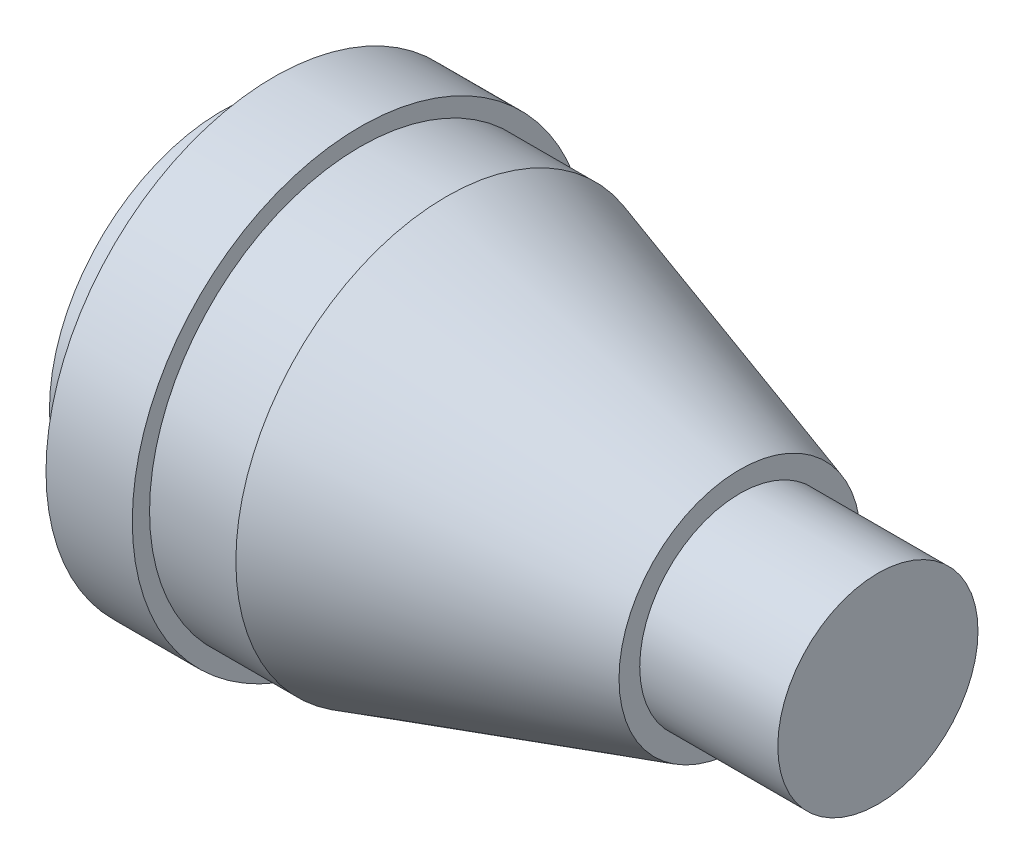
ISO-10303-21;
HEADER;
FILE_DESCRIPTION(('STEP AP214'),'2;1');
FILE_NAME('part.step','',(''),(''),'','','');
FILE_SCHEMA(('AUTOMOTIVE_DESIGN { 1 0 10303 214 1 1 1 1 }'));
ENDSEC;
DATA;
#1=APPLICATION_CONTEXT('core data for automotive mechanical design processes');
#2=APPLICATION_PROTOCOL_DEFINITION('international standard','automotive_design',2000,#1);
#3=PRODUCT_CONTEXT('',#1,'mechanical');
#4=PRODUCT('Part','Part','',(#3));
#5=PRODUCT_RELATED_PRODUCT_CATEGORY('part','',(#4));
#6=PRODUCT_DEFINITION_FORMATION('','',#4);
#7=PRODUCT_DEFINITION_CONTEXT('part definition',#1,'design');
#8=PRODUCT_DEFINITION('design','',#6,#7);
#9=PRODUCT_DEFINITION_SHAPE('','',#8);
#10=(LENGTH_UNIT() NAMED_UNIT(*) SI_UNIT(.MILLI.,.METRE.));
#11=(NAMED_UNIT(*) PLANE_ANGLE_UNIT() SI_UNIT($,.RADIAN.));
#12=(NAMED_UNIT(*) SI_UNIT($,.STERADIAN.) SOLID_ANGLE_UNIT());
#13=UNCERTAINTY_MEASURE_WITH_UNIT(LENGTH_MEASURE(1.E-05),#10,'distance_accuracy_value','');
#14=(GEOMETRIC_REPRESENTATION_CONTEXT(3) GLOBAL_UNCERTAINTY_ASSIGNED_CONTEXT((#13)) GLOBAL_UNIT_ASSIGNED_CONTEXT((#10,
#11,#12)) REPRESENTATION_CONTEXT('',''));
#15=CARTESIAN_POINT('',(0.,0.,0.));
#16=DIRECTION('',(0.,0.,1.));
#17=DIRECTION('',(1.,0.,0.));
#18=AXIS2_PLACEMENT_3D('',#15,#16,#17);
#19=CARTESIAN_POINT('',(0.,0.,0.));
#20=DIRECTION('',(1.,0.,0.));
#21=DIRECTION('',(0.,0.,-1.));
#22=AXIS2_PLACEMENT_3D('',#19,#20,#21);
#23=PLANE('',#22);
#24=CARTESIAN_POINT('',(0.,0.,0.));
#25=DIRECTION('',(-1.,0.,0.));
#26=DIRECTION('',(0.,0.,1.));
#27=AXIS2_PLACEMENT_3D('',#24,#25,#26);
#28=CIRCLE('',#27,10.);
#29=CARTESIAN_POINT('',(0.,0.,10.));
#30=VERTEX_POINT('',#29);
#31=EDGE_CURVE('E10',#30,#30,#28,.T.);
#32=ORIENTED_EDGE('',*,*,#31,.T.);
#33=EDGE_LOOP('',(#32));
#34=FACE_BOUND('',#33,.T.);
#35=ADVANCED_FACE('F32',(#34),#23,.F.);
#36=CARTESIAN_POINT('',(0.,0.,0.));
#37=DIRECTION('',(-1.,0.,0.));
#38=DIRECTION('',(0.,0.,1.));
#39=AXIS2_PLACEMENT_3D('',#36,#37,#38);
#40=CYLINDRICAL_SURFACE('',#39,10.);
#41=ORIENTED_EDGE('',*,*,#31,.F.);
#42=EDGE_LOOP('',(#41));
#43=FACE_BOUND('',#42,.T.);
#44=CARTESIAN_POINT('',(3.,0.,0.));
#45=DIRECTION('',(-1.,0.,0.));
#46=DIRECTION('',(0.,0.,1.));
#47=AXIS2_PLACEMENT_3D('',#44,#45,#46);
#48=CIRCLE('',#47,10.);
#49=CARTESIAN_POINT('',(3.,0.,10.));
#50=VERTEX_POINT('',#49);
#51=EDGE_CURVE('E38',#50,#50,#48,.T.);
#52=ORIENTED_EDGE('',*,*,#51,.T.);
#53=EDGE_LOOP('',(#52));
#54=FACE_BOUND('',#53,.T.);
#55=ADVANCED_FACE('F79',(#43,#54),#40,.T.);
#56=CARTESIAN_POINT('',(3.,10.,0.));
#57=DIRECTION('',(1.,0.,0.));
#58=DIRECTION('',(0.,0.,-1.));
#59=AXIS2_PLACEMENT_3D('',#56,#57,#58);
#60=PLANE('',#59);
#61=ORIENTED_EDGE('',*,*,#51,.F.);
#62=EDGE_LOOP('',(#61));
#63=FACE_BOUND('',#62,.T.);
#64=CARTESIAN_POINT('',(3.,0.,0.));
#65=DIRECTION('',(-1.,0.,0.));
#66=DIRECTION('',(0.,0.,1.));
#67=AXIS2_PLACEMENT_3D('',#64,#65,#66);
#68=CIRCLE('',#67,13.2);
#69=CARTESIAN_POINT('',(3.,0.,13.2));
#70=VERTEX_POINT('',#69);
#71=EDGE_CURVE('E42',#70,#70,#68,.T.);
#72=ORIENTED_EDGE('',*,*,#71,.T.);
#73=EDGE_LOOP('',(#72));
#74=FACE_BOUND('',#73,.T.);
#75=ADVANCED_FACE('F83',(#63,#74),#60,.F.);
#76=CARTESIAN_POINT('',(0.,0.,0.));
#77=DIRECTION('',(-1.,0.,0.));
#78=DIRECTION('',(0.,0.,1.));
#79=AXIS2_PLACEMENT_3D('',#76,#77,#78);
#80=CYLINDRICAL_SURFACE('',#79,13.2);
#81=ORIENTED_EDGE('',*,*,#71,.F.);
#82=EDGE_LOOP('',(#81));
#83=FACE_BOUND('',#82,.T.);
#84=CARTESIAN_POINT('',(8.,0.,0.));
#85=DIRECTION('',(-1.,0.,0.));
#86=DIRECTION('',(0.,0.,1.));
#87=AXIS2_PLACEMENT_3D('',#84,#85,#86);
#88=CIRCLE('',#87,13.2);
#89=CARTESIAN_POINT('',(8.,0.,13.2));
#90=VERTEX_POINT('',#89);
#91=EDGE_CURVE('E46',#90,#90,#88,.T.);
#92=ORIENTED_EDGE('',*,*,#91,.T.);
#93=EDGE_LOOP('',(#92));
#94=FACE_BOUND('',#93,.T.);
#95=ADVANCED_FACE('F88',(#83,#94),#80,.T.);
#96=CARTESIAN_POINT('',(8.,13.2,0.));
#97=DIRECTION('',(-1.,0.,0.));
#98=DIRECTION('',(0.,0.,1.));
#99=AXIS2_PLACEMENT_3D('',#96,#97,#98);
#100=PLANE('',#99);
#101=ORIENTED_EDGE('',*,*,#91,.F.);
#102=EDGE_LOOP('',(#101));
#103=FACE_BOUND('',#102,.T.);
#104=CARTESIAN_POINT('',(8.,0.,0.));
#105=DIRECTION('',(-1.,0.,0.));
#106=DIRECTION('',(0.,0.,1.));
#107=AXIS2_PLACEMENT_3D('',#104,#105,#106);
#108=CIRCLE('',#107,12.2);
#109=CARTESIAN_POINT('',(8.,0.,12.2));
#110=VERTEX_POINT('',#109);
#111=EDGE_CURVE('E51',#110,#110,#108,.T.);
#112=ORIENTED_EDGE('',*,*,#111,.T.);
#113=EDGE_LOOP('',(#112));
#114=FACE_BOUND('',#113,.T.);
#115=ADVANCED_FACE('F94',(#103,#114),#100,.F.);
#116=CARTESIAN_POINT('',(0.,0.,0.));
#117=DIRECTION('',(-1.,0.,0.));
#118=DIRECTION('',(0.,0.,1.));
#119=AXIS2_PLACEMENT_3D('',#116,#117,#118);
#120=CYLINDRICAL_SURFACE('',#119,12.2);
#121=ORIENTED_EDGE('',*,*,#111,.F.);
#122=EDGE_LOOP('',(#121));
#123=FACE_BOUND('',#122,.T.);
#124=CARTESIAN_POINT('',(13.,0.,0.));
#125=DIRECTION('',(-1.,0.,0.));
#126=DIRECTION('',(0.,0.,1.));
#127=AXIS2_PLACEMENT_3D('',#124,#125,#126);
#128=CIRCLE('',#127,12.2);
#129=CARTESIAN_POINT('',(13.,0.,12.2));
#130=VERTEX_POINT('',#129);
#131=EDGE_CURVE('E54',#130,#130,#128,.T.);
#132=ORIENTED_EDGE('',*,*,#131,.T.);
#133=EDGE_LOOP('',(#132));
#134=FACE_BOUND('',#133,.T.);
#135=ADVANCED_FACE('F98',(#123,#134),#120,.T.);
#136=CARTESIAN_POINT('',(30.,0.,0.));
#137=DIRECTION('',(-1.,0.,0.));
#138=DIRECTION('',(0.,0.,1.));
#139=AXIS2_PLACEMENT_3D('',#136,#137,#138);
#140=CONICAL_SURFACE('',#139,7.,0.296844673376403);
#141=ORIENTED_EDGE('',*,*,#131,.F.);
#142=EDGE_LOOP('',(#141));
#143=FACE_BOUND('',#142,.T.);
#144=CARTESIAN_POINT('',(30.,0.,0.));
#145=DIRECTION('',(-1.,0.,0.));
#146=DIRECTION('',(0.,0.,1.));
#147=AXIS2_PLACEMENT_3D('',#144,#145,#146);
#148=CIRCLE('',#147,7.);
#149=CARTESIAN_POINT('',(30.,0.,7.));
#150=VERTEX_POINT('',#149);
#151=EDGE_CURVE('E57',#150,#150,#148,.T.);
#152=ORIENTED_EDGE('',*,*,#151,.T.);
#153=EDGE_LOOP('',(#152));
#154=FACE_BOUND('',#153,.T.);
#155=ADVANCED_FACE('F102',(#143,#154),#140,.T.);
#156=CARTESIAN_POINT('',(30.,7.,0.));
#157=DIRECTION('',(-1.,0.,0.));
#158=DIRECTION('',(0.,0.,1.));
#159=AXIS2_PLACEMENT_3D('',#156,#157,#158);
#160=PLANE('',#159);
#161=ORIENTED_EDGE('',*,*,#151,.F.);
#162=EDGE_LOOP('',(#161));
#163=FACE_BOUND('',#162,.T.);
#164=CARTESIAN_POINT('',(30.,0.,0.));
#165=DIRECTION('',(-1.,0.,0.));
#166=DIRECTION('',(0.,0.,1.));
#167=AXIS2_PLACEMENT_3D('',#164,#165,#166);
#168=CIRCLE('',#167,5.8);
#169=CARTESIAN_POINT('',(30.,0.,5.8));
#170=VERTEX_POINT('',#169);
#171=EDGE_CURVE('E60',#170,#170,#168,.T.);
#172=ORIENTED_EDGE('',*,*,#171,.T.);
#173=EDGE_LOOP('',(#172));
#174=FACE_BOUND('',#173,.T.);
#175=ADVANCED_FACE('F75',(#163,#174),#160,.F.);
#176=CARTESIAN_POINT('',(0.,0.,0.));
#177=DIRECTION('',(-1.,0.,0.));
#178=DIRECTION('',(0.,0.,1.));
#179=AXIS2_PLACEMENT_3D('',#176,#177,#178);
#180=CYLINDRICAL_SURFACE('',#179,5.8);
#181=ORIENTED_EDGE('',*,*,#171,.F.);
#182=EDGE_LOOP('',(#181));
#183=FACE_BOUND('',#182,.T.);
#184=CARTESIAN_POINT('',(38.,0.,0.));
#185=DIRECTION('',(-1.,0.,0.));
#186=DIRECTION('',(0.,0.,1.));
#187=AXIS2_PLACEMENT_3D('',#184,#185,#186);
#188=CIRCLE('',#187,5.8);
#189=CARTESIAN_POINT('',(38.,0.,5.8));
#190=VERTEX_POINT('',#189);
#191=EDGE_CURVE('E63',#190,#190,#188,.T.);
#192=ORIENTED_EDGE('',*,*,#191,.T.);
#193=EDGE_LOOP('',(#192));
#194=FACE_BOUND('',#193,.T.);
#195=ADVANCED_FACE('F67',(#183,#194),#180,.T.);
#196=CARTESIAN_POINT('',(38.,5.8,0.));
#197=DIRECTION('',(-1.,0.,0.));
#198=DIRECTION('',(0.,0.,1.));
#199=AXIS2_PLACEMENT_3D('',#196,#197,#198);
#200=PLANE('',#199);
#201=ORIENTED_EDGE('',*,*,#191,.F.);
#202=EDGE_LOOP('',(#201));
#203=FACE_BOUND('',#202,.T.);
#204=ADVANCED_FACE('F69',(#203),#200,.F.);
#205=CLOSED_SHELL('',(#35,#55,#75,#95,#115,#135,#155,#175,#195,#204));
#206=MANIFOLD_SOLID_BREP('B2',#205);
#207=ADVANCED_BREP_SHAPE_REPRESENTATION('',(#18,#206),#14);
#208=SHAPE_DEFINITION_REPRESENTATION(#9,#207);
ENDSEC;
END-ISO-10303-21;
